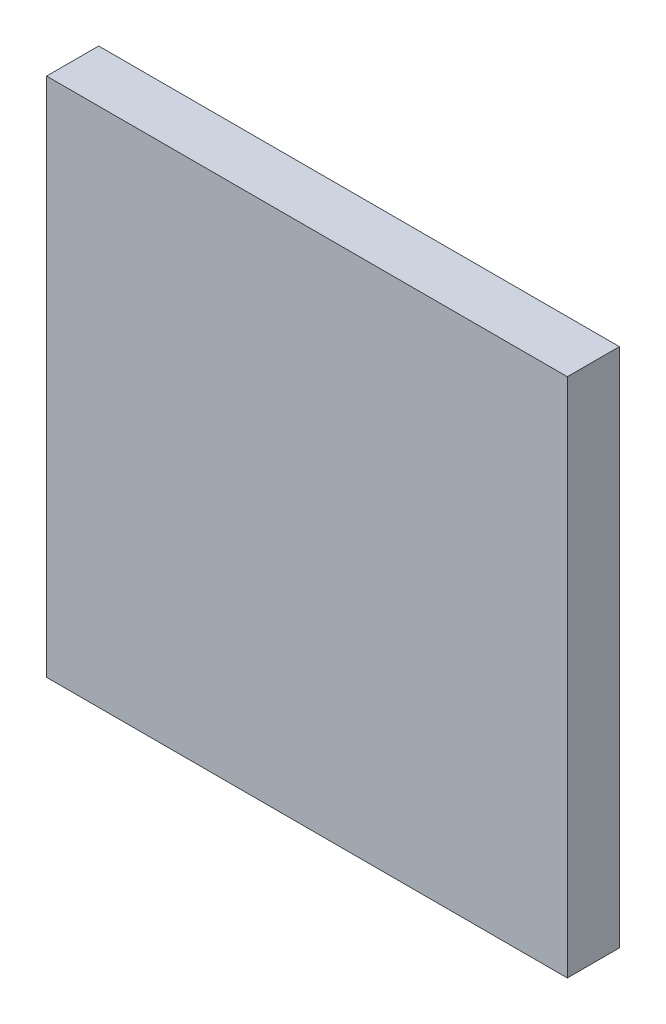
ISO-10303-21;
HEADER;
FILE_DESCRIPTION(('STEP AP214'),'2;1');
FILE_NAME('part.step','',(''),(''),'','','');
FILE_SCHEMA(('AUTOMOTIVE_DESIGN { 1 0 10303 214 1 1 1 1 }'));
ENDSEC;
DATA;
#1=APPLICATION_CONTEXT('core data for automotive mechanical design processes');
#2=APPLICATION_PROTOCOL_DEFINITION('international standard','automotive_design',2000,#1);
#3=PRODUCT_CONTEXT('',#1,'mechanical');
#4=PRODUCT('Part','Part','',(#3));
#5=PRODUCT_RELATED_PRODUCT_CATEGORY('part','',(#4));
#6=PRODUCT_DEFINITION_FORMATION('','',#4);
#7=PRODUCT_DEFINITION_CONTEXT('part definition',#1,'design');
#8=PRODUCT_DEFINITION('design','',#6,#7);
#9=PRODUCT_DEFINITION_SHAPE('','',#8);
#10=(LENGTH_UNIT() NAMED_UNIT(*) SI_UNIT(.MILLI.,.METRE.));
#11=(NAMED_UNIT(*) PLANE_ANGLE_UNIT() SI_UNIT($,.RADIAN.));
#12=(NAMED_UNIT(*) SI_UNIT($,.STERADIAN.) SOLID_ANGLE_UNIT());
#13=UNCERTAINTY_MEASURE_WITH_UNIT(LENGTH_MEASURE(1.E-05),#10,'distance_accuracy_value','');
#14=(GEOMETRIC_REPRESENTATION_CONTEXT(3) GLOBAL_UNCERTAINTY_ASSIGNED_CONTEXT((#13)) GLOBAL_UNIT_ASSIGNED_CONTEXT((#10,
#11,#12)) REPRESENTATION_CONTEXT('',''));
#15=CARTESIAN_POINT('',(0.,0.,0.));
#16=DIRECTION('',(0.,0.,1.));
#17=DIRECTION('',(1.,0.,0.));
#18=AXIS2_PLACEMENT_3D('',#15,#16,#17);
#19=CARTESIAN_POINT('',(50.,50.,10.));
#20=DIRECTION('',(-1.,0.,0.));
#21=DIRECTION('',(0.,-1.,0.));
#22=AXIS2_PLACEMENT_3D('',#19,#20,#21);
#23=PLANE('',#22);
#24=DIRECTION('',(0.,1.,0.));
#25=VECTOR('',#24,1.);
#26=CARTESIAN_POINT('',(50.,50.,0.));
#27=LINE('',#26,#25);
#28=CARTESIAN_POINT('',(50.,-50.,0.));
#29=VERTEX_POINT('',#28);
#30=CARTESIAN_POINT('',(50.,50.,0.));
#31=VERTEX_POINT('',#30);
#32=EDGE_CURVE('E113',#29,#31,#27,.T.);
#33=ORIENTED_EDGE('',*,*,#32,.T.);
#34=DIRECTION('',(0.,0.,-1.));
#35=VECTOR('',#34,1.);
#36=CARTESIAN_POINT('',(50.,50.,10.));
#37=LINE('',#36,#35);
#38=CARTESIAN_POINT('',(50.,50.,10.));
#39=VERTEX_POINT('',#38);
#40=EDGE_CURVE('E11',#39,#31,#37,.T.);
#41=ORIENTED_EDGE('',*,*,#40,.F.);
#42=DIRECTION('',(0.,1.,0.));
#43=VECTOR('',#42,1.);
#44=CARTESIAN_POINT('',(50.,50.,10.));
#45=LINE('',#44,#43);
#46=CARTESIAN_POINT('',(50.,-50.,10.));
#47=VERTEX_POINT('',#46);
#48=EDGE_CURVE('E97',#47,#39,#45,.T.);
#49=ORIENTED_EDGE('',*,*,#48,.F.);
#50=DIRECTION('',(0.,0.,-1.));
#51=VECTOR('',#50,1.);
#52=CARTESIAN_POINT('',(50.,-50.,10.));
#53=LINE('',#52,#51);
#54=EDGE_CURVE('E109',#47,#29,#53,.T.);
#55=ORIENTED_EDGE('',*,*,#54,.T.);
#56=EDGE_LOOP('',(#33,#41,#49,#55));
#57=FACE_BOUND('',#56,.T.);
#58=ADVANCED_FACE('F45',(#57),#23,.F.);
#59=CARTESIAN_POINT('',(-50.,50.,10.));
#60=DIRECTION('',(0.,-1.,0.));
#61=DIRECTION('',(0.,0.,-1.));
#62=AXIS2_PLACEMENT_3D('',#59,#60,#61);
#63=PLANE('',#62);
#64=DIRECTION('',(-1.,0.,0.));
#65=VECTOR('',#64,1.);
#66=CARTESIAN_POINT('',(-50.,50.,0.));
#67=LINE('',#66,#65);
#68=CARTESIAN_POINT('',(-50.,50.,0.));
#69=VERTEX_POINT('',#68);
#70=EDGE_CURVE('E102',#31,#69,#67,.T.);
#71=ORIENTED_EDGE('',*,*,#70,.T.);
#72=DIRECTION('',(0.,0.,-1.));
#73=VECTOR('',#72,1.);
#74=CARTESIAN_POINT('',(-50.,50.,10.));
#75=LINE('',#74,#73);
#76=CARTESIAN_POINT('',(-50.,50.,10.));
#77=VERTEX_POINT('',#76);
#78=EDGE_CURVE('E54',#77,#69,#75,.T.);
#79=ORIENTED_EDGE('',*,*,#78,.F.);
#80=DIRECTION('',(-1.,0.,0.));
#81=VECTOR('',#80,1.);
#82=CARTESIAN_POINT('',(-50.,50.,10.));
#83=LINE('',#82,#81);
#84=EDGE_CURVE('E92',#39,#77,#83,.T.);
#85=ORIENTED_EDGE('',*,*,#84,.F.);
#86=ORIENTED_EDGE('',*,*,#40,.T.);
#87=EDGE_LOOP('',(#71,#79,#85,#86));
#88=FACE_BOUND('',#87,.T.);
#89=ADVANCED_FACE('F101',(#88),#63,.F.);
#90=CARTESIAN_POINT('',(-50.,50.,10.));
#91=DIRECTION('',(1.,0.,0.));
#92=DIRECTION('',(0.,1.,0.));
#93=AXIS2_PLACEMENT_3D('',#90,#91,#92);
#94=PLANE('',#93);
#95=DIRECTION('',(0.,-1.,0.));
#96=VECTOR('',#95,1.);
#97=CARTESIAN_POINT('',(-50.,50.,0.));
#98=LINE('',#97,#96);
#99=CARTESIAN_POINT('',(-50.,-50.,0.));
#100=VERTEX_POINT('',#99);
#101=EDGE_CURVE('E79',#69,#100,#98,.T.);
#102=ORIENTED_EDGE('',*,*,#101,.T.);
#103=DIRECTION('',(0.,0.,-1.));
#104=VECTOR('',#103,1.);
#105=CARTESIAN_POINT('',(-50.,-50.,10.));
#106=LINE('',#105,#104);
#107=CARTESIAN_POINT('',(-50.,-50.,10.));
#108=VERTEX_POINT('',#107);
#109=EDGE_CURVE('E104',#108,#100,#106,.T.);
#110=ORIENTED_EDGE('',*,*,#109,.F.);
#111=DIRECTION('',(0.,-1.,0.));
#112=VECTOR('',#111,1.);
#113=CARTESIAN_POINT('',(-50.,50.,10.));
#114=LINE('',#113,#112);
#115=EDGE_CURVE('E95',#77,#108,#114,.T.);
#116=ORIENTED_EDGE('',*,*,#115,.F.);
#117=ORIENTED_EDGE('',*,*,#78,.T.);
#118=EDGE_LOOP('',(#102,#110,#116,#117));
#119=FACE_BOUND('',#118,.T.);
#120=ADVANCED_FACE('F105',(#119),#94,.F.);
#121=CARTESIAN_POINT('',(-50.,-50.,10.));
#122=DIRECTION('',(0.,1.,0.));
#123=DIRECTION('',(0.,0.,1.));
#124=AXIS2_PLACEMENT_3D('',#121,#122,#123);
#125=PLANE('',#124);
#126=DIRECTION('',(1.,0.,0.));
#127=VECTOR('',#126,1.);
#128=CARTESIAN_POINT('',(-50.,-50.,0.));
#129=LINE('',#128,#127);
#130=EDGE_CURVE('E85',#100,#29,#129,.T.);
#131=ORIENTED_EDGE('',*,*,#130,.T.);
#132=ORIENTED_EDGE('',*,*,#54,.F.);
#133=DIRECTION('',(1.,0.,0.));
#134=VECTOR('',#133,1.);
#135=CARTESIAN_POINT('',(-50.,-50.,10.));
#136=LINE('',#135,#134);
#137=EDGE_CURVE('E62',#108,#47,#136,.T.);
#138=ORIENTED_EDGE('',*,*,#137,.F.);
#139=ORIENTED_EDGE('',*,*,#109,.T.);
#140=EDGE_LOOP('',(#131,#132,#138,#139));
#141=FACE_BOUND('',#140,.T.);
#142=ADVANCED_FACE('F126',(#141),#125,.F.);
#143=CARTESIAN_POINT('',(0.,0.,10.));
#144=DIRECTION('',(0.,0.,1.));
#145=DIRECTION('',(1.,0.,0.));
#146=AXIS2_PLACEMENT_3D('',#143,#144,#145);
#147=PLANE('',#146);
#148=ORIENTED_EDGE('',*,*,#48,.T.);
#149=ORIENTED_EDGE('',*,*,#84,.T.);
#150=ORIENTED_EDGE('',*,*,#115,.T.);
#151=ORIENTED_EDGE('',*,*,#137,.T.);
#152=EDGE_LOOP('',(#148,#149,#150,#151));
#153=FACE_BOUND('',#152,.T.);
#154=ADVANCED_FACE('F93',(#153),#147,.T.);
#155=CARTESIAN_POINT('',(0.,0.,0.));
#156=DIRECTION('',(0.,0.,1.));
#157=DIRECTION('',(1.,0.,0.));
#158=AXIS2_PLACEMENT_3D('',#155,#156,#157);
#159=PLANE('',#158);
#160=ORIENTED_EDGE('',*,*,#32,.F.);
#161=ORIENTED_EDGE('',*,*,#130,.F.);
#162=ORIENTED_EDGE('',*,*,#101,.F.);
#163=ORIENTED_EDGE('',*,*,#70,.F.);
#164=EDGE_LOOP('',(#160,#161,#162,#163));
#165=FACE_BOUND('',#164,.T.);
#166=ADVANCED_FACE('F129',(#165),#159,.F.);
#167=CLOSED_SHELL('',(#58,#89,#120,#142,#154,#166));
#168=MANIFOLD_SOLID_BREP('B2',#167);
#169=ADVANCED_BREP_SHAPE_REPRESENTATION('',(#18,#168),#14);
#170=SHAPE_DEFINITION_REPRESENTATION(#9,#169);
ENDSEC;
END-ISO-10303-21;
